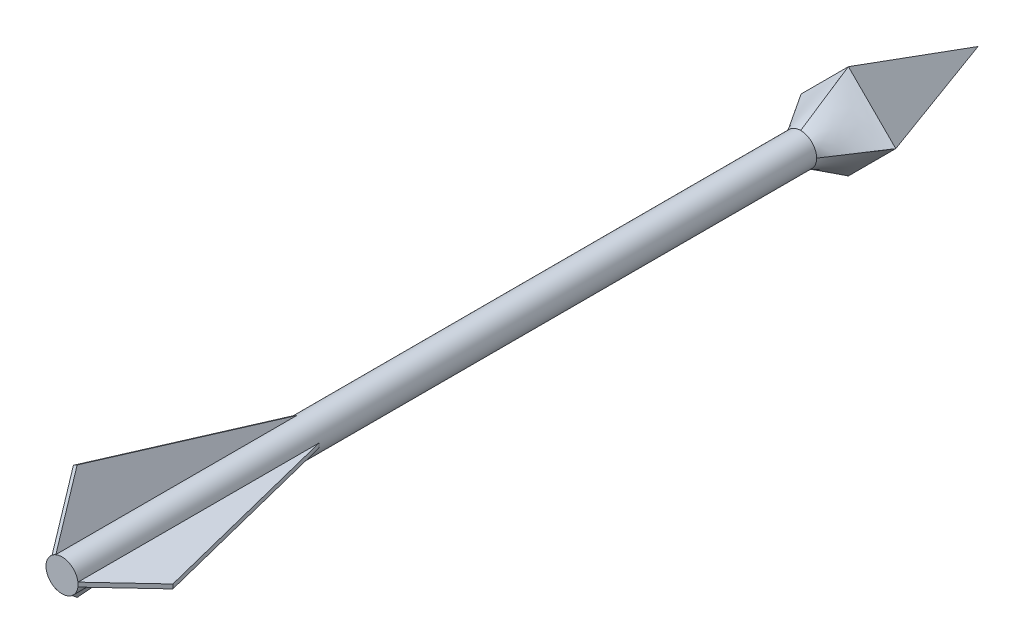
ISO-10303-21;
HEADER;
FILE_DESCRIPTION(('STEP AP214'),'2;1');
FILE_NAME('part.step','',(''),(''),'','','');
FILE_SCHEMA(('AUTOMOTIVE_DESIGN { 1 0 10303 214 1 1 1 1 }'));
ENDSEC;
DATA;
#1=APPLICATION_CONTEXT('core data for automotive mechanical design processes');
#2=APPLICATION_PROTOCOL_DEFINITION('international standard','automotive_design',2000,#1);
#3=PRODUCT_CONTEXT('',#1,'mechanical');
#4=PRODUCT('Part','Part','',(#3));
#5=PRODUCT_RELATED_PRODUCT_CATEGORY('part','',(#4));
#6=PRODUCT_DEFINITION_FORMATION('','',#4);
#7=PRODUCT_DEFINITION_CONTEXT('part definition',#1,'design');
#8=PRODUCT_DEFINITION('design','',#6,#7);
#9=PRODUCT_DEFINITION_SHAPE('','',#8);
#10=(LENGTH_UNIT() NAMED_UNIT(*) SI_UNIT(.MILLI.,.METRE.));
#11=(NAMED_UNIT(*) PLANE_ANGLE_UNIT() SI_UNIT($,.RADIAN.));
#12=(NAMED_UNIT(*) SI_UNIT($,.STERADIAN.) SOLID_ANGLE_UNIT());
#13=UNCERTAINTY_MEASURE_WITH_UNIT(LENGTH_MEASURE(1.E-05),#10,'distance_accuracy_value','');
#14=(GEOMETRIC_REPRESENTATION_CONTEXT(3) GLOBAL_UNCERTAINTY_ASSIGNED_CONTEXT((#13)) GLOBAL_UNIT_ASSIGNED_CONTEXT((#10,
#11,#12)) REPRESENTATION_CONTEXT('',''));
#15=CARTESIAN_POINT('',(0.,0.,0.));
#16=DIRECTION('',(0.,0.,1.));
#17=DIRECTION('',(1.,0.,0.));
#18=AXIS2_PLACEMENT_3D('',#15,#16,#17);
#19=CARTESIAN_POINT('',(-11.3747679879071,19.2016760793635,23.8961325797691));
#20=DIRECTION('',(0.341269166287983,-0.591095535067471,-0.73084979617183));
#21=DIRECTION('',(0.365424898085909,-0.632934489835487,0.682538332575977));
#22=AXIS2_PLACEMENT_3D('',#19,#20,#21);
#23=PLANE('',#22);
#24=DIRECTION('',(-0.365424898085909,0.632934489835487,-0.682538332575977));
#25=VECTOR('',#24,1.);
#26=CARTESIAN_POINT('',(-10.9417552860149,19.4516760793635,23.8961325797691));
#27=LINE('',#26,#25);
#28=CARTESIAN_POINT('',(-0.715632082149516,1.7395111258093,42.9964213582362));
#29=VERTEX_POINT('',#28);
#30=CARTESIAN_POINT('',(-3.57024866431473,6.68385208224818,37.6645864111912));
#31=VERTEX_POINT('',#30);
#32=EDGE_CURVE('E123',#29,#31,#27,.T.);
#33=ORIENTED_EDGE('',*,*,#32,.T.);
#34=DIRECTION('',(0.866025403784443,0.499999999999992,0.));
#35=VECTOR('',#34,1.);
#36=CARTESIAN_POINT('',(-4.00326136620696,6.43385208224819,37.6645864111912));
#37=LINE('',#36,#35);
#38=CARTESIAN_POINT('',(-4.00326136620696,6.43385208224819,37.6645864111912));
#39=VERTEX_POINT('',#38);
#40=EDGE_CURVE('E13',#39,#31,#37,.T.);
#41=ORIENTED_EDGE('',*,*,#40,.F.);
#42=DIRECTION('',(-0.365424898085909,0.632934489835487,-0.682538332575977));
#43=VECTOR('',#42,1.);
#44=CARTESIAN_POINT('',(-11.3747679879071,19.2016760793635,23.8961325797691));
#45=LINE('',#44,#43);
#46=CARTESIAN_POINT('',(-1.14864478404174,1.4895111258093,42.9964213582362));
#47=VERTEX_POINT('',#46);
#48=EDGE_CURVE('E118',#47,#39,#45,.T.);
#49=ORIENTED_EDGE('',*,*,#48,.F.);
#50=DIRECTION('',(0.866025403784443,0.499999999999992,0.));
#51=VECTOR('',#50,1.);
#52=CARTESIAN_POINT('',(-1.14864478404174,1.4895111258093,42.9964213582362));
#53=LINE('',#52,#51);
#54=EDGE_CURVE('E93',#47,#29,#53,.T.);
#55=ORIENTED_EDGE('',*,*,#54,.T.);
#56=EDGE_LOOP('',(#33,#41,#49,#55));
#57=FACE_BOUND('',#56,.T.);
#58=ADVANCED_FACE('F77',(#57),#23,.F.);
#59=CARTESIAN_POINT('',(0.671690679983306,-1.66340238470161,0.446261734044505));
#60=DIRECTION('',(0.484931983438938,-0.839926833531409,0.243647051596933));
#61=DIRECTION('',(-0.121823525798464,0.211004536240123,0.969863966877892));
#62=AXIS2_PLACEMENT_3D('',#59,#60,#61);
#63=PLANE('',#62);
#64=DIRECTION('',(0.121823525798464,-0.211004536240123,-0.969863966877892));
#65=VECTOR('',#64,1.);
#66=CARTESIAN_POINT('',(1.10470338187553,-1.41340238470161,0.446261734044505));
#67=LINE('',#66,#65);
#68=CARTESIAN_POINT('',(-0.715632082149516,1.7395111258093,14.9383539848345));
#69=VERTEX_POINT('',#68);
#70=EDGE_CURVE('E126',#31,#69,#67,.T.);
#71=ORIENTED_EDGE('',*,*,#70,.T.);
#72=DIRECTION('',(0.866025403784443,0.499999999999992,0.));
#73=VECTOR('',#72,1.);
#74=CARTESIAN_POINT('',(-1.14864478404174,1.4895111258093,14.9383539848345));
#75=LINE('',#74,#73);
#76=CARTESIAN_POINT('',(-1.14864478404174,1.4895111258093,14.9383539848345));
#77=VERTEX_POINT('',#76);
#78=EDGE_CURVE('E85',#77,#69,#75,.T.);
#79=ORIENTED_EDGE('',*,*,#78,.F.);
#80=DIRECTION('',(0.121823525798464,-0.211004536240123,-0.969863966877892));
#81=VECTOR('',#80,1.);
#82=CARTESIAN_POINT('',(0.671690679983306,-1.66340238470161,0.446261734044505));
#83=LINE('',#82,#81);
#84=EDGE_CURVE('E111',#39,#77,#83,.T.);
#85=ORIENTED_EDGE('',*,*,#84,.F.);
#86=ORIENTED_EDGE('',*,*,#40,.T.);
#87=EDGE_LOOP('',(#71,#79,#85,#86));
#88=FACE_BOUND('',#87,.T.);
#89=ADVANCED_FACE('F113',(#88),#63,.F.);
#90=CARTESIAN_POINT('',(-1.14864478404174,1.4895111258093,0.));
#91=DIRECTION('',(0.499999999999992,-0.866025403784443,0.));
#92=DIRECTION('',(0.,0.,1.));
#93=AXIS2_PLACEMENT_3D('',#90,#91,#92);
#94=PLANE('',#93);
#95=DIRECTION('',(0.,0.,-1.));
#96=VECTOR('',#95,1.);
#97=CARTESIAN_POINT('',(-0.715632082149516,1.7395111258093,0.));
#98=LINE('',#97,#96);
#99=EDGE_CURVE('E121',#29,#69,#98,.T.);
#100=ORIENTED_EDGE('',*,*,#99,.F.);
#101=ORIENTED_EDGE('',*,*,#54,.F.);
#102=DIRECTION('',(0.,0.,-1.));
#103=VECTOR('',#102,1.);
#104=CARTESIAN_POINT('',(-1.14864478404174,1.4895111258093,0.));
#105=LINE('',#104,#103);
#106=EDGE_CURVE('E117',#47,#77,#105,.T.);
#107=ORIENTED_EDGE('',*,*,#106,.T.);
#108=ORIENTED_EDGE('',*,*,#78,.T.);
#109=EDGE_LOOP('',(#100,#101,#107,#108));
#110=FACE_BOUND('',#109,.T.);
#111=ADVANCED_FACE('F132',(#110),#94,.T.);
#112=CARTESIAN_POINT('',(-0.216506350946111,-0.124999999999998,0.));
#113=DIRECTION('',(-0.866025403784443,-0.499999999999992,0.));
#114=DIRECTION('',(0.,0.,1.));
#115=AXIS2_PLACEMENT_3D('',#112,#113,#114);
#116=PLANE('',#115);
#117=ORIENTED_EDGE('',*,*,#48,.T.);
#118=ORIENTED_EDGE('',*,*,#84,.T.);
#119=ORIENTED_EDGE('',*,*,#106,.F.);
#120=EDGE_LOOP('',(#117,#118,#119));
#121=FACE_BOUND('',#120,.T.);
#122=ADVANCED_FACE('F120',(#121),#116,.T.);
#123=CARTESIAN_POINT('',(0.216506350946111,0.124999999999998,0.));
#124=DIRECTION('',(-0.866025403784443,-0.499999999999992,0.));
#125=DIRECTION('',(0.,0.,1.));
#126=AXIS2_PLACEMENT_3D('',#123,#124,#125);
#127=PLANE('',#126);
#128=ORIENTED_EDGE('',*,*,#32,.F.);
#129=ORIENTED_EDGE('',*,*,#99,.T.);
#130=ORIENTED_EDGE('',*,*,#70,.F.);
#131=EDGE_LOOP('',(#128,#129,#130));
#132=FACE_BOUND('',#131,.T.);
#133=ADVANCED_FACE('F139',(#132),#127,.F.);
#134=CLOSED_SHELL('',(#58,#89,#111,#122,#133));
#135=MANIFOLD_SOLID_BREP('B2',#134);
#136=CARTESIAN_POINT('',(-10.9417552860152,-19.4516760793634,23.8961325797691));
#137=DIRECTION('',(0.341269166287991,0.591095535067466,-0.73084979617183));
#138=DIRECTION('',(0.365424898085918,0.632934489835482,0.682538332575977));
#139=AXIS2_PLACEMENT_3D('',#136,#137,#138);
#140=PLANE('',#139);
#141=DIRECTION('',(-0.365424898085918,-0.632934489835482,-0.682538332575977));
#142=VECTOR('',#141,1.);
#143=CARTESIAN_POINT('',(-11.3747679879074,-19.2016760793634,23.8961325797691));
#144=LINE('',#143,#142);
#145=CARTESIAN_POINT('',(-1.14864478404176,-1.48951112580929,42.9964213582362));
#146=VERTEX_POINT('',#145);
#147=CARTESIAN_POINT('',(-4.00326136620705,-6.43385208224813,37.6645864111912));
#148=VERTEX_POINT('',#147);
#149=EDGE_CURVE('E230',#146,#148,#144,.T.);
#150=ORIENTED_EDGE('',*,*,#149,.T.);
#151=DIRECTION('',(-0.866025403784436,0.500000000000004,0.));
#152=VECTOR('',#151,1.);
#153=CARTESIAN_POINT('',(-3.57024866431483,-6.68385208224813,37.6645864111912));
#154=LINE('',#153,#152);
#155=CARTESIAN_POINT('',(-3.57024866431483,-6.68385208224813,37.6645864111912));
#156=VERTEX_POINT('',#155);
#157=EDGE_CURVE('E75',#156,#148,#154,.T.);
#158=ORIENTED_EDGE('',*,*,#157,.F.);
#159=DIRECTION('',(-0.365424898085918,-0.632934489835482,-0.682538332575977));
#160=VECTOR('',#159,1.);
#161=CARTESIAN_POINT('',(-10.9417552860152,-19.4516760793634,23.8961325797691));
#162=LINE('',#161,#160);
#163=CARTESIAN_POINT('',(-0.71563208214954,-1.73951112580929,42.9964213582362));
#164=VERTEX_POINT('',#163);
#165=EDGE_CURVE('E225',#164,#156,#162,.T.);
#166=ORIENTED_EDGE('',*,*,#165,.F.);
#167=DIRECTION('',(-0.866025403784436,0.500000000000004,0.));
#168=VECTOR('',#167,1.);
#169=CARTESIAN_POINT('',(-0.71563208214954,-1.73951112580929,42.9964213582362));
#170=LINE('',#169,#168);
#171=EDGE_CURVE('E200',#164,#146,#170,.T.);
#172=ORIENTED_EDGE('',*,*,#171,.T.);
#173=EDGE_LOOP('',(#150,#158,#166,#172));
#174=FACE_BOUND('',#173,.T.);
#175=ADVANCED_FACE('F184',(#174),#140,.F.);
#176=CARTESIAN_POINT('',(1.10470338187555,1.4134023847016,0.446261734044505));
#177=DIRECTION('',(0.48493198343895,0.839926833531402,0.243647051596933));
#178=DIRECTION('',(-0.121823525798467,-0.211004536240121,0.969863966877892));
#179=AXIS2_PLACEMENT_3D('',#176,#177,#178);
#180=PLANE('',#179);
#181=DIRECTION('',(0.121823525798467,0.211004536240121,-0.969863966877892));
#182=VECTOR('',#181,1.);
#183=CARTESIAN_POINT('',(0.67169067998333,1.6634023847016,0.446261734044505));
#184=LINE('',#183,#182);
#185=CARTESIAN_POINT('',(-1.14864478404176,-1.48951112580929,14.9383539848345));
#186=VERTEX_POINT('',#185);
#187=EDGE_CURVE('E233',#148,#186,#184,.T.);
#188=ORIENTED_EDGE('',*,*,#187,.T.);
#189=DIRECTION('',(-0.866025403784436,0.500000000000004,0.));
#190=VECTOR('',#189,1.);
#191=CARTESIAN_POINT('',(-0.71563208214954,-1.73951112580929,14.9383539848345));
#192=LINE('',#191,#190);
#193=CARTESIAN_POINT('',(-0.71563208214954,-1.73951112580929,14.9383539848345));
#194=VERTEX_POINT('',#193);
#195=EDGE_CURVE('E192',#194,#186,#192,.T.);
#196=ORIENTED_EDGE('',*,*,#195,.F.);
#197=DIRECTION('',(0.121823525798467,0.211004536240121,-0.969863966877892));
#198=VECTOR('',#197,1.);
#199=CARTESIAN_POINT('',(1.10470338187555,1.4134023847016,0.446261734044505));
#200=LINE('',#199,#198);
#201=EDGE_CURVE('E218',#156,#194,#200,.T.);
#202=ORIENTED_EDGE('',*,*,#201,.F.);
#203=ORIENTED_EDGE('',*,*,#157,.T.);
#204=EDGE_LOOP('',(#188,#196,#202,#203));
#205=FACE_BOUND('',#204,.T.);
#206=ADVANCED_FACE('F220',(#205),#180,.F.);
#207=CARTESIAN_POINT('',(-0.71563208214954,-1.73951112580929,0.));
#208=DIRECTION('',(0.500000000000004,0.866025403784436,0.));
#209=DIRECTION('',(0.,0.,1.));
#210=AXIS2_PLACEMENT_3D('',#207,#208,#209);
#211=PLANE('',#210);
#212=DIRECTION('',(0.,0.,-1.));
#213=VECTOR('',#212,1.);
#214=CARTESIAN_POINT('',(-1.14864478404176,-1.48951112580929,0.));
#215=LINE('',#214,#213);
#216=EDGE_CURVE('E228',#146,#186,#215,.T.);
#217=ORIENTED_EDGE('',*,*,#216,.F.);
#218=ORIENTED_EDGE('',*,*,#171,.F.);
#219=DIRECTION('',(0.,0.,-1.));
#220=VECTOR('',#219,1.);
#221=CARTESIAN_POINT('',(-0.71563208214954,-1.73951112580929,0.));
#222=LINE('',#221,#220);
#223=EDGE_CURVE('E224',#164,#194,#222,.T.);
#224=ORIENTED_EDGE('',*,*,#223,.T.);
#225=ORIENTED_EDGE('',*,*,#195,.T.);
#226=EDGE_LOOP('',(#217,#218,#224,#225));
#227=FACE_BOUND('',#226,.T.);
#228=ADVANCED_FACE('F239',(#227),#211,.T.);
#229=CARTESIAN_POINT('',(0.216506350946109,-0.125000000000001,0.));
#230=DIRECTION('',(0.866025403784436,-0.500000000000004,0.));
#231=DIRECTION('',(0.,0.,1.));
#232=AXIS2_PLACEMENT_3D('',#229,#230,#231);
#233=PLANE('',#232);
#234=ORIENTED_EDGE('',*,*,#165,.T.);
#235=ORIENTED_EDGE('',*,*,#201,.T.);
#236=ORIENTED_EDGE('',*,*,#223,.F.);
#237=EDGE_LOOP('',(#234,#235,#236));
#238=FACE_BOUND('',#237,.T.);
#239=ADVANCED_FACE('F227',(#238),#233,.T.);
#240=CARTESIAN_POINT('',(-0.216506350946109,0.125000000000001,0.));
#241=DIRECTION('',(0.866025403784436,-0.500000000000004,0.));
#242=DIRECTION('',(0.,0.,1.));
#243=AXIS2_PLACEMENT_3D('',#240,#241,#242);
#244=PLANE('',#243);
#245=ORIENTED_EDGE('',*,*,#149,.F.);
#246=ORIENTED_EDGE('',*,*,#216,.T.);
#247=ORIENTED_EDGE('',*,*,#187,.F.);
#248=EDGE_LOOP('',(#245,#246,#247));
#249=FACE_BOUND('',#248,.T.);
#250=ADVANCED_FACE('F246',(#249),#244,.F.);
#251=CLOSED_SHELL('',(#175,#206,#228,#239,#250));
#252=MANIFOLD_SOLID_BREP('B7',#251);
#253=CARTESIAN_POINT('',(22.3165232739224,0.25,23.8961325797691));
#254=DIRECTION('',(-0.682538332575977,0.,-0.73084979617183));
#255=DIRECTION('',(-0.73084979617183,0.,0.682538332575977));
#256=AXIS2_PLACEMENT_3D('',#253,#254,#255);
#257=PLANE('',#256);
#258=DIRECTION('',(0.73084979617183,0.,-0.682538332575977));
#259=VECTOR('',#258,1.);
#260=CARTESIAN_POINT('',(22.3165232739224,-0.25,23.8961325797691));
#261=LINE('',#260,#259);
#262=CARTESIAN_POINT('',(1.86427686619128,-0.25,42.9964213582362));
#263=VERTEX_POINT('',#262);
#264=CARTESIAN_POINT('',(7.57351003052181,-0.25,37.6645864111912));
#265=VERTEX_POINT('',#264);
#266=EDGE_CURVE('E336',#263,#265,#261,.T.);
#267=ORIENTED_EDGE('',*,*,#266,.T.);
#268=DIRECTION('',(0.,-1.,0.));
#269=VECTOR('',#268,1.);
#270=CARTESIAN_POINT('',(7.57351003052181,0.25,37.6645864111912));
#271=LINE('',#270,#269);
#272=CARTESIAN_POINT('',(7.57351003052181,0.25,37.6645864111912));
#273=VERTEX_POINT('',#272);
#274=EDGE_CURVE('E182',#273,#265,#271,.T.);
#275=ORIENTED_EDGE('',*,*,#274,.F.);
#276=DIRECTION('',(0.73084979617183,0.,-0.682538332575977));
#277=VECTOR('',#276,1.);
#278=CARTESIAN_POINT('',(22.3165232739224,0.25,23.8961325797691));
#279=LINE('',#278,#277);
#280=CARTESIAN_POINT('',(1.86427686619128,0.25,42.9964213582362));
#281=VERTEX_POINT('',#280);
#282=EDGE_CURVE('E331',#281,#273,#279,.T.);
#283=ORIENTED_EDGE('',*,*,#282,.F.);
#284=DIRECTION('',(0.,-1.,0.));
#285=VECTOR('',#284,1.);
#286=CARTESIAN_POINT('',(1.86427686619128,0.25,42.9964213582362));
#287=LINE('',#286,#285);
#288=EDGE_CURVE('E306',#281,#263,#287,.T.);
#289=ORIENTED_EDGE('',*,*,#288,.T.);
#290=EDGE_LOOP('',(#267,#275,#283,#289));
#291=FACE_BOUND('',#290,.T.);
#292=ADVANCED_FACE('F290',(#291),#257,.F.);
#293=CARTESIAN_POINT('',(-1.77639406185886,0.25,0.446261734044505));
#294=DIRECTION('',(-0.969863966877892,0.,0.243647051596933));
#295=DIRECTION('',(0.243647051596933,0.,0.969863966877892));
#296=AXIS2_PLACEMENT_3D('',#293,#294,#295);
#297=PLANE('',#296);
#298=DIRECTION('',(-0.243647051596933,0.,-0.969863966877892));
#299=VECTOR('',#298,1.);
#300=CARTESIAN_POINT('',(-1.77639406185886,-0.25,0.446261734044505));
#301=LINE('',#300,#299);
#302=CARTESIAN_POINT('',(1.86427686619128,-0.25,14.9383539848345));
#303=VERTEX_POINT('',#302);
#304=EDGE_CURVE('E339',#265,#303,#301,.T.);
#305=ORIENTED_EDGE('',*,*,#304,.T.);
#306=DIRECTION('',(0.,-1.,0.));
#307=VECTOR('',#306,1.);
#308=CARTESIAN_POINT('',(1.86427686619128,0.25,14.9383539848345));
#309=LINE('',#308,#307);
#310=CARTESIAN_POINT('',(1.86427686619128,0.25,14.9383539848345));
#311=VERTEX_POINT('',#310);
#312=EDGE_CURVE('E298',#311,#303,#309,.T.);
#313=ORIENTED_EDGE('',*,*,#312,.F.);
#314=DIRECTION('',(-0.243647051596933,0.,-0.969863966877892));
#315=VECTOR('',#314,1.);
#316=CARTESIAN_POINT('',(-1.77639406185886,0.25,0.446261734044505));
#317=LINE('',#316,#315);
#318=EDGE_CURVE('E324',#273,#311,#317,.T.);
#319=ORIENTED_EDGE('',*,*,#318,.F.);
#320=ORIENTED_EDGE('',*,*,#274,.T.);
#321=EDGE_LOOP('',(#305,#313,#319,#320));
#322=FACE_BOUND('',#321,.T.);
#323=ADVANCED_FACE('F326',(#322),#297,.F.);
#324=CARTESIAN_POINT('',(1.86427686619128,0.25,0.));
#325=DIRECTION('',(-1.,0.,0.));
#326=DIRECTION('',(0.,0.,1.));
#327=AXIS2_PLACEMENT_3D('',#324,#325,#326);
#328=PLANE('',#327);
#329=DIRECTION('',(0.,0.,-1.));
#330=VECTOR('',#329,1.);
#331=CARTESIAN_POINT('',(1.86427686619128,-0.25,0.));
#332=LINE('',#331,#330);
#333=EDGE_CURVE('E334',#263,#303,#332,.T.);
#334=ORIENTED_EDGE('',*,*,#333,.F.);
#335=ORIENTED_EDGE('',*,*,#288,.F.);
#336=DIRECTION('',(0.,0.,-1.));
#337=VECTOR('',#336,1.);
#338=CARTESIAN_POINT('',(1.86427686619128,0.25,0.));
#339=LINE('',#338,#337);
#340=EDGE_CURVE('E330',#281,#311,#339,.T.);
#341=ORIENTED_EDGE('',*,*,#340,.T.);
#342=ORIENTED_EDGE('',*,*,#312,.T.);
#343=EDGE_LOOP('',(#334,#335,#341,#342));
#344=FACE_BOUND('',#343,.T.);
#345=ADVANCED_FACE('F345',(#344),#328,.T.);
#346=CARTESIAN_POINT('',(0.,0.25,0.));
#347=DIRECTION('',(0.,1.,0.));
#348=DIRECTION('',(0.,0.,1.));
#349=AXIS2_PLACEMENT_3D('',#346,#347,#348);
#350=PLANE('',#349);
#351=ORIENTED_EDGE('',*,*,#282,.T.);
#352=ORIENTED_EDGE('',*,*,#318,.T.);
#353=ORIENTED_EDGE('',*,*,#340,.F.);
#354=EDGE_LOOP('',(#351,#352,#353));
#355=FACE_BOUND('',#354,.T.);
#356=ADVANCED_FACE('F333',(#355),#350,.T.);
#357=CARTESIAN_POINT('',(0.,-0.25,0.));
#358=DIRECTION('',(0.,1.,0.));
#359=DIRECTION('',(0.,0.,1.));
#360=AXIS2_PLACEMENT_3D('',#357,#358,#359);
#361=PLANE('',#360);
#362=ORIENTED_EDGE('',*,*,#266,.F.);
#363=ORIENTED_EDGE('',*,*,#333,.T.);
#364=ORIENTED_EDGE('',*,*,#304,.F.);
#365=EDGE_LOOP('',(#362,#363,#364));
#366=FACE_BOUND('',#365,.T.);
#367=ADVANCED_FACE('F352',(#366),#361,.F.);
#368=CLOSED_SHELL('',(#292,#323,#345,#356,#367));
#369=MANIFOLD_SOLID_BREP('B69',#368);
#370=CARTESIAN_POINT('',(0.,0.,42.9964213582362));
#371=DIRECTION('',(0.,0.,-1.));
#372=DIRECTION('',(-1.,0.,0.));
#373=AXIS2_PLACEMENT_3D('',#370,#371,#372);
#374=PLANE('',#373);
#375=CARTESIAN_POINT('',(0.,0.,42.9964213582362));
#376=DIRECTION('',(0.,0.,-1.));
#377=DIRECTION('',(-1.,0.,0.));
#378=AXIS2_PLACEMENT_3D('',#375,#376,#377);
#379=CIRCLE('',#378,1.86427686619128);
#380=CARTESIAN_POINT('',(-1.86427686619128,0.,42.9964213582362));
#381=VERTEX_POINT('',#380);
#382=EDGE_CURVE('E288',#381,#381,#379,.T.);
#383=ORIENTED_EDGE('',*,*,#382,.F.);
#384=EDGE_LOOP('',(#383));
#385=FACE_BOUND('',#384,.T.);
#386=ADVANCED_FACE('F388',(#385),#374,.F.);
#387=CARTESIAN_POINT('',(0.,0.,-63.6469159290233));
#388=DIRECTION('',(0.,0.,-1.));
#389=DIRECTION('',(-1.,0.,0.));
#390=AXIS2_PLACEMENT_3D('',#387,#388,#389);
#391=CYLINDRICAL_SURFACE('',#390,1.86427686619128);
#392=CARTESIAN_POINT('',(-1.86427686619128,0.,-42.9964213582362));
#393=CARTESIAN_POINT('',(-1.86428270601178,0.0524318803976472,-42.9964433896541));
#394=CARTESIAN_POINT('',(-1.86206523022339,0.104863699002284,-42.9965263707443));
#395=CARTESIAN_POINT('',(-1.85322498472643,0.209352078093115,-42.9966938199869));
#396=CARTESIAN_POINT('',(-1.84660243935823,0.261408657552936,-42.9967782880634));
#397=CARTESIAN_POINT('',(-1.82900001198042,0.364737933597131,-42.996828306932));
#398=CARTESIAN_POINT('',(-1.81802341378971,0.416011190765503,-42.9967939471935));
#399=CARTESIAN_POINT('',(-1.79178966783767,0.517456779233548,-42.9966545787557));
#400=CARTESIAN_POINT('',(-1.77653258122061,0.56762912624804,-42.9965495710656));
#401=CARTESIAN_POINT('',(-1.75052014123938,0.641790479091365,-42.9964387491247));
#402=CARTESIAN_POINT('',(-1.74132437432959,0.666336583763045,-42.9964095880247));
#403=CARTESIAN_POINT('',(-1.72190656774221,0.715019408420174,-42.9964342952568));
#404=CARTESIAN_POINT('',(-1.71168452904697,0.739156128797464,-42.9964881635094));
#405=CARTESIAN_POINT('',(-1.67950538611825,0.81088553022716,-42.9967237387634));
#406=CARTESIAN_POINT('',(-1.65603158011933,0.85780792464424,-42.9969794077647));
#407=CARTESIAN_POINT('',(-1.60522120119517,0.949494825714478,-42.9973421260281));
#408=CARTESIAN_POINT('',(-1.57788532267364,0.994259718351892,-42.9974492019701));
#409=CARTESIAN_POINT('',(-1.51954081860156,1.08132796580144,-42.9974101321394));
#410=CARTESIAN_POINT('',(-1.48853220847946,1.12363133095286,-42.9972639874306));
#411=CARTESIAN_POINT('',(-1.42306409007354,1.20547148556822,-42.9968540547957));
#412=CARTESIAN_POINT('',(-1.3886052743717,1.24500882757772,-42.9965902904438));
#413=CARTESIAN_POINT('',(-1.33452102689567,1.30202489655381,-42.9964254861057));
#414=CARTESIAN_POINT('',(-1.31609140493958,1.3206505566927,-42.9964090361343));
#415=CARTESIAN_POINT('',(-1.27846395067144,1.35710885033665,-42.9964782273987));
#416=CARTESIAN_POINT('',(-1.25926611643255,1.37494148185241,-42.9965638688906));
#417=CARTESIAN_POINT('',(-1.20056403623964,1.42720657873475,-42.9968599982645));
#418=CARTESIAN_POINT('',(-1.15995036340317,1.46040714168543,-42.9971096932254));
#419=CARTESIAN_POINT('',(-1.07607623930595,1.52326475167148,-42.9974144447953));
#420=CARTESIAN_POINT('',(-1.03281583841916,1.55292186611597,-42.9974695051076));
#421=CARTESIAN_POINT('',(-0.943940737369396,1.60849338267224,-42.9973355853831));
#422=CARTESIAN_POINT('',(-0.89832556782759,1.6344070346546,-42.9971465565101));
#423=CARTESIAN_POINT('',(-0.805072245597529,1.68230049308141,-42.9967288889016));
#424=CARTESIAN_POINT('',(-0.757433964313325,1.70428004899671,-42.9965002476454));
#425=CARTESIAN_POINT('',(-0.660496668543537,1.74413779939021,-42.9963716749132));
#426=CARTESIAN_POINT('',(-0.611198494101473,1.76201803372271,-42.9964715795689));
#427=CARTESIAN_POINT('',(-0.511291007451994,1.79355931088054,-42.9966611162171));
#428=CARTESIAN_POINT('',(-0.460682008805347,1.8072213528143,-42.9967507506389));
#429=CARTESIAN_POINT('',(-0.342388017622672,1.83385821447901,-42.9968357718419));
#430=CARTESIAN_POINT('',(-0.274339596422201,1.84526481801524,-42.9967926394995));
#431=CARTESIAN_POINT('',(-0.171719384799283,1.85667074035494,-42.9966391632023));
#432=CARTESIAN_POINT('',(-0.137438541838059,1.85952204817448,-42.9965732628588));
#433=CARTESIAN_POINT('',(-0.0687746361683523,1.86332485448751,-42.996465697083));
#434=CARTESIAN_POINT('',(-0.0343915827591553,1.86427652081717,-42.9964240295098));
#435=CARTESIAN_POINT('',(0.,1.86427686619128,-42.9964213582362));
#436=B_SPLINE_CURVE_WITH_KNOTS('',3,(#392,#393,#394,#395,#396,#397,#398,#399,#400,#401,#402,
#403,#404,#405,#406,#407,#408,#409,#410,#411,#412,#413,#414,#415,#416,#417,#418,#419,#420,#421,
#422,#423,#424,#425,#426,#427,#428,#429,#430,#431,#432,#433,#434,#435),.UNSPECIFIED.,.F.,.F.,(4,
2,2,2,2,2,2,2,2,2,2,2,2,2,2,2,2,2,2,2,2,4),(0.,0.157249241578817,0.314490475417621,
0.471613342994179,0.628733966276864,0.70735009004232,0.785966138556107,0.943165045697661,
1.1003357242364,1.25750574255477,1.41464427413627,1.49323117570741,1.5718182744033,
1.72898878144459,1.88615629806194,2.04335526495465,2.20056423895451,2.3576948139295,
2.51478814282513,2.72130033602189,2.82445404310626,2.92759863600289),.UNSPECIFIED.);
#437=CARTESIAN_POINT('',(-1.86427686619128,0.,-42.9964213582362));
#438=VERTEX_POINT('',#437);
#439=CARTESIAN_POINT('',(0.,1.86427686619128,-42.9964213582362));
#440=VERTEX_POINT('',#439);
#441=EDGE_CURVE('E398',#438,#440,#436,.T.);
#442=ORIENTED_EDGE('',*,*,#441,.F.);
#443=CARTESIAN_POINT('',(0.,-1.86427686619128,-42.9964213582362));
#444=CARTESIAN_POINT('',(-0.052431880397618,-1.86428270601178,-42.9964433896541));
#445=CARTESIAN_POINT('',(-0.104863699002255,-1.86206523022339,-42.9965263707443));
#446=CARTESIAN_POINT('',(-0.209352078093086,-1.85322498472643,-42.9966938199869));
#447=CARTESIAN_POINT('',(-0.261408657552907,-1.84660243935824,-42.9967782880634));
#448=CARTESIAN_POINT('',(-0.364737933597102,-1.82900001198043,-42.996828306932));
#449=CARTESIAN_POINT('',(-0.416011190765474,-1.81802341378971,-42.9967939471935));
#450=CARTESIAN_POINT('',(-0.517456779233519,-1.79178966783768,-42.9966545787557));
#451=CARTESIAN_POINT('',(-0.567629126248012,-1.77653258122062,-42.9965495710656));
#452=CARTESIAN_POINT('',(-0.641790479091337,-1.75052014123939,-42.9964387491247));
#453=CARTESIAN_POINT('',(-0.666336583763017,-1.7413243743296,-42.9964095880246));
#454=CARTESIAN_POINT('',(-0.715019408420146,-1.72190656774222,-42.9964342952568));
#455=CARTESIAN_POINT('',(-0.739156128797436,-1.71168452904698,-42.9964881635094));
#456=CARTESIAN_POINT('',(-0.810885530227134,-1.67950538611826,-42.9967237387634));
#457=CARTESIAN_POINT('',(-0.857807924644213,-1.65603158011935,-42.9969794077647));
#458=CARTESIAN_POINT('',(-0.949494825714452,-1.60522120119519,-42.9973421260281));
#459=CARTESIAN_POINT('',(-0.994259718351867,-1.57788532267365,-42.9974492019701));
#460=CARTESIAN_POINT('',(-1.08132796580142,-1.51954081860158,-42.9974101321394));
#461=CARTESIAN_POINT('',(-1.12363133095284,-1.48853220847948,-42.9972639874305));
#462=CARTESIAN_POINT('',(-1.2054714855682,-1.42306409007356,-42.9968540547957));
#463=CARTESIAN_POINT('',(-1.2450088275777,-1.38860527437172,-42.9965902904437));
#464=CARTESIAN_POINT('',(-1.30202489655379,-1.33452102689569,-42.9964254861057));
#465=CARTESIAN_POINT('',(-1.32065055669267,-1.31609140493961,-42.9964090361343));
#466=CARTESIAN_POINT('',(-1.35710885033663,-1.27846395067146,-42.9964782273987));
#467=CARTESIAN_POINT('',(-1.37494148185239,-1.25926611643257,-42.9965638688906));
#468=CARTESIAN_POINT('',(-1.42720657873473,-1.20056403623966,-42.9968599982645));
#469=CARTESIAN_POINT('',(-1.46040714168541,-1.15995036340319,-42.9971096932254));
#470=CARTESIAN_POINT('',(-1.52326475167146,-1.07607623930598,-42.9974144447953));
#471=CARTESIAN_POINT('',(-1.55292186611595,-1.03281583841919,-42.9974695051076));
#472=CARTESIAN_POINT('',(-1.60849338267222,-0.943940737369421,-42.9973355853831));
#473=CARTESIAN_POINT('',(-1.63440703465459,-0.898325567827615,-42.9971465565101));
#474=CARTESIAN_POINT('',(-1.68230049308139,-0.805072245597554,-42.9967288889016));
#475=CARTESIAN_POINT('',(-1.7042800489967,-0.757433964313351,-42.9965002476453));
#476=CARTESIAN_POINT('',(-1.7441377993902,-0.660496668543563,-42.9963716749132));
#477=CARTESIAN_POINT('',(-1.7620180337227,-0.6111984941015,-42.996471579569));
#478=CARTESIAN_POINT('',(-1.79355931088054,-0.511291007452021,-42.9966611162171));
#479=CARTESIAN_POINT('',(-1.80722135281429,-0.460682008805374,-42.9967507506389));
#480=CARTESIAN_POINT('',(-1.83385821447901,-0.342388017622695,-42.9968357718419));
#481=CARTESIAN_POINT('',(-1.84526481801524,-0.274339596422219,-42.9967926394995));
#482=CARTESIAN_POINT('',(-1.85667074035494,-0.171719384799294,-42.9966391632023));
#483=CARTESIAN_POINT('',(-1.85952204817448,-0.137438541838069,-42.9965732628588));
#484=CARTESIAN_POINT('',(-1.86332485448751,-0.0687746361683569,-42.996465697083));
#485=CARTESIAN_POINT('',(-1.86427652081717,-0.0343915827591576,-42.9964240295098));
#486=CARTESIAN_POINT('',(-1.86427686619128,0.,-42.9964213582362));
#487=B_SPLINE_CURVE_WITH_KNOTS('',3,(#443,#444,#445,#446,#447,#448,#449,#450,#451,#452,#453,
#454,#455,#456,#457,#458,#459,#460,#461,#462,#463,#464,#465,#466,#467,#468,#469,#470,#471,#472,
#473,#474,#475,#476,#477,#478,#479,#480,#481,#482,#483,#484,#485,#486),.UNSPECIFIED.,.F.,.F.,(4,
2,2,2,2,2,2,2,2,2,2,2,2,2,2,2,2,2,2,2,2,4),(0.,0.157249241578816,0.314490475417621,
0.471613342994178,0.628733966276863,0.707350090042319,0.785966138556107,0.94316504569766,
1.1003357242364,1.25750574255477,1.41464427413626,1.49323117570741,1.5718182744033,
1.72898878144459,1.88615629806194,2.04335526495465,2.20056423895451,2.3576948139295,
2.51478814282513,2.7213003360219,2.82445404310629,2.92759863600292),.UNSPECIFIED.);
#488=CARTESIAN_POINT('',(0.,-1.86427686619128,-42.9964213582362));
#489=VERTEX_POINT('',#488);
#490=EDGE_CURVE('E538',#489,#438,#487,.T.);
#491=ORIENTED_EDGE('',*,*,#490,.F.);
#492=CARTESIAN_POINT('',(1.86427686619128,0.,-42.9964213582362));
#493=CARTESIAN_POINT('',(1.86428270601179,-0.05243188039759,-42.9964433896541));
#494=CARTESIAN_POINT('',(1.86206523022339,-0.104863699002227,-42.9965263707443));
#495=CARTESIAN_POINT('',(1.85322498472644,-0.209352078093058,-42.9966938199869));
#496=CARTESIAN_POINT('',(1.84660243935824,-0.261408657552879,-42.9967782880634));
#497=CARTESIAN_POINT('',(1.82900001198043,-0.364737933597075,-42.996828306932));
#498=CARTESIAN_POINT('',(1.81802341378972,-0.416011190765447,-42.9967939471935));
#499=CARTESIAN_POINT('',(1.79178966783768,-0.517456779233493,-42.9966545787557));
#500=CARTESIAN_POINT('',(1.77653258122063,-0.567629126247986,-42.9965495710656));
#501=CARTESIAN_POINT('',(1.7505201412394,-0.641790479091311,-42.9964387491247));
#502=CARTESIAN_POINT('',(1.74132437432961,-0.666336583762992,-42.9964095880246));
#503=CARTESIAN_POINT('',(1.72190656774223,-0.715019408420121,-42.9964342952568));
#504=CARTESIAN_POINT('',(1.71168452904699,-0.739156128797411,-42.9964881635094));
#505=CARTESIAN_POINT('',(1.67950538611827,-0.810885530227109,-42.9967237387634));
#506=CARTESIAN_POINT('',(1.65603158011936,-0.857807924644189,-42.9969794077647));
#507=CARTESIAN_POINT('',(1.6052212011952,-0.949494825714429,-42.9973421260281));
#508=CARTESIAN_POINT('',(1.57788532267367,-0.994259718351844,-42.9974492019701));
#509=CARTESIAN_POINT('',(1.5195408186016,-1.08132796580139,-42.9974101321394));
#510=CARTESIAN_POINT('',(1.48853220847949,-1.12363133095282,-42.9972639874306));
#511=CARTESIAN_POINT('',(1.42306409007358,-1.20547148556818,-42.9968540547957));
#512=CARTESIAN_POINT('',(1.38860527437174,-1.24500882757768,-42.9965902904437));
#513=CARTESIAN_POINT('',(1.33452102689571,-1.30202489655377,-42.9964254861057));
#514=CARTESIAN_POINT('',(1.31609140493962,-1.32065055669266,-42.9964090361343));
#515=CARTESIAN_POINT('',(1.27846395067148,-1.35710885033662,-42.9964782273987));
#516=CARTESIAN_POINT('',(1.25926611643259,-1.37494148185238,-42.9965638688906));
#517=CARTESIAN_POINT('',(1.20056403623969,-1.42720657873471,-42.9968599982645));
#518=CARTESIAN_POINT('',(1.15995036340322,-1.4604071416854,-42.9971096932254));
#519=CARTESIAN_POINT('',(1.076076239306,-1.52326475167145,-42.9974144447953));
#520=CARTESIAN_POINT('',(1.03281583841921,-1.55292186611594,-42.9974695051076));
#521=CARTESIAN_POINT('',(0.943940737369445,-1.60849338267221,-42.9973355853831));
#522=CARTESIAN_POINT('',(0.89832556782764,-1.63440703465457,-42.9971465565101));
#523=CARTESIAN_POINT('',(0.80507224559758,-1.68230049308138,-42.9967288889016));
#524=CARTESIAN_POINT('',(0.757433964313376,-1.70428004899668,-42.9965002476453));
#525=CARTESIAN_POINT('',(0.660496668543589,-1.74413779939019,-42.9963716749132));
#526=CARTESIAN_POINT('',(0.611198494101526,-1.76201803372269,-42.996471579569));
#527=CARTESIAN_POINT('',(0.511291007452048,-1.79355931088053,-42.9966611162171));
#528=CARTESIAN_POINT('',(0.460682008805401,-1.80722135281428,-42.9967507506389));
#529=CARTESIAN_POINT('',(0.342388017622718,-1.833858214479,-42.9968357718419));
#530=CARTESIAN_POINT('',(0.274339596422238,-1.84526481801524,-42.9967926394996));
#531=CARTESIAN_POINT('',(0.171719384799306,-1.85667074035494,-42.9966391632023));
#532=CARTESIAN_POINT('',(0.137438541838078,-1.85952204817448,-42.9965732628588));
#533=CARTESIAN_POINT('',(0.0687746361683618,-1.86332485448751,-42.996465697083));
#534=CARTESIAN_POINT('',(0.0343915827591602,-1.86427652081717,-42.9964240295098));
#535=CARTESIAN_POINT('',(0.,-1.86427686619128,-42.9964213582362));
#536=B_SPLINE_CURVE_WITH_KNOTS('',3,(#492,#493,#494,#495,#496,#497,#498,#499,#500,#501,#502,
#503,#504,#505,#506,#507,#508,#509,#510,#511,#512,#513,#514,#515,#516,#517,#518,#519,#520,#521,
#522,#523,#524,#525,#526,#527,#528,#529,#530,#531,#532,#533,#534,#535),.UNSPECIFIED.,.F.,.F.,(4,
2,2,2,2,2,2,2,2,2,2,2,2,2,2,2,2,2,2,2,2,4),(0.,0.157249241578816,0.314490475417621,
0.471613342994179,0.628733966276864,0.70735009004232,0.785966138556107,0.943165045697661,
1.1003357242364,1.25750574255477,1.41464427413627,1.49323117570741,1.5718182744033,
1.72898878144459,1.88615629806194,2.04335526495465,2.20056423895451,2.3576948139295,
2.51478814282513,2.72130033602192,2.82445404310631,2.92759863600295),.UNSPECIFIED.);
#537=CARTESIAN_POINT('',(1.86427686619128,0.,-42.9964213582362));
#538=VERTEX_POINT('',#537);
#539=EDGE_CURVE('E406',#538,#489,#536,.T.);
#540=ORIENTED_EDGE('',*,*,#539,.F.);
#541=CARTESIAN_POINT('',(0.,1.86427686619128,-42.9964213582362));
#542=CARTESIAN_POINT('',(0.0524318803976183,1.86428270601179,-42.9964433896541));
#543=CARTESIAN_POINT('',(0.104863699002255,1.86206523022339,-42.9965263707443));
#544=CARTESIAN_POINT('',(0.209352078093086,1.85322498472643,-42.9966938199869));
#545=CARTESIAN_POINT('',(0.261408657552907,1.84660243935824,-42.9967782880634));
#546=CARTESIAN_POINT('',(0.364737933597102,1.82900001198042,-42.996828306932));
#547=CARTESIAN_POINT('',(0.416011190765475,1.81802341378971,-42.9967939471935));
#548=CARTESIAN_POINT('',(0.51745677923352,1.79178966783768,-42.9966545787557));
#549=CARTESIAN_POINT('',(0.567629126248013,1.77653258122062,-42.9965495710656));
#550=CARTESIAN_POINT('',(0.641790479091338,1.75052014123939,-42.9964387491246));
#551=CARTESIAN_POINT('',(0.666336583763018,1.7413243743296,-42.9964095880246));
#552=CARTESIAN_POINT('',(0.715019408420147,1.72190656774222,-42.9964342952568));
#553=CARTESIAN_POINT('',(0.739156128797437,1.71168452904698,-42.9964881635094));
#554=CARTESIAN_POINT('',(0.810885530227135,1.67950538611826,-42.9967237387634));
#555=CARTESIAN_POINT('',(0.857807924644214,1.65603158011935,-42.9969794077647));
#556=CARTESIAN_POINT('',(0.949494825714453,1.60522120119519,-42.9973421260281));
#557=CARTESIAN_POINT('',(0.994259718351868,1.57788532267365,-42.9974492019701));
#558=CARTESIAN_POINT('',(1.08132796580142,1.51954081860158,-42.9974101321394));
#559=CARTESIAN_POINT('',(1.12363133095284,1.48853220847948,-42.9972639874305));
#560=CARTESIAN_POINT('',(1.2054714855682,1.42306409007356,-42.9968540547957));
#561=CARTESIAN_POINT('',(1.2450088275777,1.38860527437172,-42.9965902904437));
#562=CARTESIAN_POINT('',(1.30202489655379,1.33452102689569,-42.9964254861057));
#563=CARTESIAN_POINT('',(1.32065055669268,1.3160914049396,-42.9964090361343));
#564=CARTESIAN_POINT('',(1.35710885033664,1.27846395067146,-42.9964782273987));
#565=CARTESIAN_POINT('',(1.3749414818524,1.25926611643257,-42.9965638688906));
#566=CARTESIAN_POINT('',(1.42720657873473,1.20056403623966,-42.9968599982645));
#567=CARTESIAN_POINT('',(1.46040714168541,1.15995036340319,-42.9971096932254));
#568=CARTESIAN_POINT('',(1.52326475167146,1.07607623930598,-42.9974144447953));
#569=CARTESIAN_POINT('',(1.55292186611595,1.03281583841919,-42.9974695051076));
#570=CARTESIAN_POINT('',(1.60849338267222,0.94394073736942,-42.9973355853831));
#571=CARTESIAN_POINT('',(1.63440703465459,0.898325567827614,-42.9971465565101));
#572=CARTESIAN_POINT('',(1.68230049308139,0.805072245597554,-42.9967288889016));
#573=CARTESIAN_POINT('',(1.7042800489967,0.75743396431335,-42.9965002476454));
#574=CARTESIAN_POINT('',(1.7441377993902,0.660496668543562,-42.9963716749132));
#575=CARTESIAN_POINT('',(1.7620180337227,0.611198494101499,-42.9964715795689));
#576=CARTESIAN_POINT('',(1.79355931088054,0.511291007452021,-42.9966611162171));
#577=CARTESIAN_POINT('',(1.80722135281429,0.460682008805374,-42.9967507506389));
#578=CARTESIAN_POINT('',(1.83385821447901,0.342388017622699,-42.9968357718419));
#579=CARTESIAN_POINT('',(1.84526481801524,0.274339596422228,-42.9967926394996));
#580=CARTESIAN_POINT('',(1.85667074035494,0.171719384799311,-42.9966391632023));
#581=CARTESIAN_POINT('',(1.85952204817448,0.137438541838087,-42.9965732628588));
#582=CARTESIAN_POINT('',(1.86332485448751,0.0687746361683804,-42.996465697083));
#583=CARTESIAN_POINT('',(1.86427652081717,0.0343915827591834,-42.9964240295098));
#584=CARTESIAN_POINT('',(1.86427686619128,0.,-42.9964213582362));
#585=B_SPLINE_CURVE_WITH_KNOTS('',3,(#541,#542,#543,#544,#545,#546,#547,#548,#549,#550,#551,
#552,#553,#554,#555,#556,#557,#558,#559,#560,#561,#562,#563,#564,#565,#566,#567,#568,#569,#570,
#571,#572,#573,#574,#575,#576,#577,#578,#579,#580,#581,#582,#583,#584),.UNSPECIFIED.,.F.,.F.,(4,
2,2,2,2,2,2,2,2,2,2,2,2,2,2,2,2,2,2,2,2,4),(0.,0.157249241578816,0.314490475417621,
0.471613342994179,0.628733966276864,0.70735009004232,0.785966138556107,0.943165045697661,
1.1003357242364,1.25750574255477,1.41464427413627,1.49323117570741,1.5718182744033,
1.72898878144459,1.88615629806194,2.04335526495465,2.20056423895451,2.3576948139295,
2.51478814282513,2.72130033602189,2.82445404310627,2.92759863600289),.UNSPECIFIED.);
#586=EDGE_CURVE('E537',#440,#538,#585,.T.);
#587=ORIENTED_EDGE('',*,*,#586,.F.);
#588=EDGE_LOOP('',(#442,#491,#540,#587));
#589=FACE_BOUND('',#588,.T.);
#590=ORIENTED_EDGE('',*,*,#382,.T.);
#591=EDGE_LOOP('',(#590));
#592=FACE_BOUND('',#591,.T.);
#593=ADVANCED_FACE('F546',(#589,#592),#391,.T.);
#594=CARTESIAN_POINT('',(-5.51069453083045,0.,-48.5624665996875));
#595=CARTESIAN_POINT('',(-1.86427686619128,0.,-42.9964213582362));
#596=CARTESIAN_POINT('',(-1.82781268954489,0.,-42.9407609058217));
#597=CARTESIAN_POINT('',(-5.05146998659458,-0.459224544235882,-48.5624665996875));
#598=CARTESIAN_POINT('',(-1.86427686619128,-0.219707135682177,-42.9964213582362));
#599=CARTESIAN_POINT('',(-1.83240493498725,-0.21731196159664,-42.9407609058217));
#600=CARTESIAN_POINT('',(-4.59224544235871,-0.918449088471766,-48.5624665996875));
#601=CARTESIAN_POINT('',(-1.82423455030632,-0.456743654704233,-42.9964213582362));
#602=CARTESIAN_POINT('',(-1.7965544413858,-0.452126600366558,-42.9407609058217));
#603=CARTESIAN_POINT('',(-3.67379635388697,-1.83689817694353,-48.5624665996875));
#604=CARTESIAN_POINT('',(-1.64253108994565,-0.915717248502965,-42.9964213582362));
#605=CARTESIAN_POINT('',(-1.62221843730624,-0.906505439218559,-42.9407609058217));
#606=CARTESIAN_POINT('',(-3.2145718096511,-2.29612272117942,-48.5624665996875));
#607=CARTESIAN_POINT('',(-1.50025416479247,-1.13623146339366,-42.9964213582362));
#608=CARTESIAN_POINT('',(-1.48311098834388,-1.1246325508158,-42.9407609058217));
#609=CARTESIAN_POINT('',(-2.29612272117936,-3.21457180965119,-48.5624665996875));
#610=CARTESIAN_POINT('',(-1.13623146339365,-1.50025416479247,-42.9964213582362));
#611=CARTESIAN_POINT('',(-1.1246325508158,-1.48311098834388,-42.9407609058217));
#612=CARTESIAN_POINT('',(-1.83689817694349,-3.67379635388707,-48.5624665996875));
#613=CARTESIAN_POINT('',(-0.915717248502965,-1.64253108994565,-42.9964213582362));
#614=CARTESIAN_POINT('',(-0.906505439218559,-1.62221843730624,-42.9407609058217));
#615=CARTESIAN_POINT('',(-0.918449088471743,-4.59224544235884,-48.5624665996875));
#616=CARTESIAN_POINT('',(-0.456743654704233,-1.82423455030632,-42.9964213582362));
#617=CARTESIAN_POINT('',(-0.452126600366558,-1.7965544413858,-42.9407609058217));
#618=CARTESIAN_POINT('',(-0.459224544235872,-5.05146998659473,-48.5624665996875));
#619=CARTESIAN_POINT('',(-0.219707135682177,-1.86427686619128,-42.9964213582362));
#620=CARTESIAN_POINT('',(-0.21731196159664,-1.83240493498725,-42.9407609058217));
#621=CARTESIAN_POINT('',(0.,-5.51069453083062,-48.5624665996875));
#622=CARTESIAN_POINT('',(0.,-1.86427686619128,-42.9964213582362));
#623=CARTESIAN_POINT('',(0.,-1.82781268954489,-42.9407609058217));
#624=B_SPLINE_SURFACE_WITH_KNOTS('',3,1,((#594,#595,#596),(#597,#598,#599),(#600,#601,#602),
(#603,#604,#605),(#606,#607,#608),(#609,#610,#611),(#612,#613,#614),(#615,#616,#617),(#618,#619,
#620),(#621,#622,#623)),.UNSPECIFIED.,.F.,.F.,.F.,(4,2,2,2,4),(2,1,2),(0.,0.25,0.5,0.75,1.),(0.,
1.,1.01),.UNSPECIFIED.);
#625=DIRECTION('',(-0.707106781186537,0.707106781186558,0.));
#626=VECTOR('',#625,1.);
#627=CARTESIAN_POINT('',(0.,-5.51069453083062,-48.5624665996875));
#628=LINE('',#627,#626);
#629=CARTESIAN_POINT('',(0.,-5.51069453083062,-48.5624665996875));
#630=VERTEX_POINT('',#629);
#631=CARTESIAN_POINT('',(-5.51069453083045,0.,-48.5624665996875));
#632=VERTEX_POINT('',#631);
#633=EDGE_CURVE('E391',#630,#632,#628,.T.);
#634=DIRECTION('',(0.,0.54799454094541,0.836481908408084));
#635=VECTOR('',#634,1.);
#636=CARTESIAN_POINT('',(0.,-3.68748569851095,-45.7794439789618));
#637=LINE('',#636,#635);
#638=EDGE_CURVE('E430',#630,#489,#637,.T.);
#639=DIRECTION('',(-0.547994540945391,0.,-0.836481908408096));
#640=VECTOR('',#639,1.);
#641=CARTESIAN_POINT('',(-3.68748569851086,0.,-45.7794439789619));
#642=LINE('',#641,#640);
#643=EDGE_CURVE('E440',#438,#632,#642,.T.);
#644=ORIENTED_EDGE('',*,*,#633,.F.);
#645=ORIENTED_EDGE('',*,*,#638,.T.);
#646=ORIENTED_EDGE('',*,*,#490,.T.);
#647=ORIENTED_EDGE('',*,*,#643,.T.);
#648=EDGE_LOOP('',(#644,#645,#646,#647));
#649=FACE_BOUND('',#648,.T.);
#650=ADVANCED_FACE('F446',(#649),#624,.T.);
#651=CARTESIAN_POINT('',(0.,-5.51069453083062,-48.5624665996875));
#652=CARTESIAN_POINT('',(0.,-1.86427686619128,-42.9964213582362));
#653=CARTESIAN_POINT('',(0.,-1.82781268954489,-42.9407609058217));
#654=CARTESIAN_POINT('',(0.45922454423587,-5.05146998659473,-48.5624665996875));
#655=CARTESIAN_POINT('',(0.219707135682179,-1.86427686619128,-42.9964213582362));
#656=CARTESIAN_POINT('',(0.217311961596642,-1.83240493498725,-42.9407609058217));
#657=CARTESIAN_POINT('',(0.918449088471741,-4.59224544235885,-48.5624665996875));
#658=CARTESIAN_POINT('',(0.456743654704237,-1.82423455030632,-42.9964213582362));
#659=CARTESIAN_POINT('',(0.452126600366562,-1.7965544413858,-42.9407609058217));
#660=CARTESIAN_POINT('',(1.83689817694348,-3.67379635388708,-48.5624665996875));
#661=CARTESIAN_POINT('',(0.915717248502973,-1.64253108994565,-42.9964213582362));
#662=CARTESIAN_POINT('',(0.906505439218568,-1.62221843730623,-42.9407609058217));
#663=CARTESIAN_POINT('',(2.29612272117935,-3.21457180965119,-48.5624665996875));
#664=CARTESIAN_POINT('',(1.13623146339367,-1.50025416479246,-42.9964213582362));
#665=CARTESIAN_POINT('',(1.12463255081581,-1.48311098834388,-42.9407609058217));
#666=CARTESIAN_POINT('',(3.21457180965109,-2.29612272117942,-48.5624665996875));
#667=CARTESIAN_POINT('',(1.50025416479248,-1.13623146339364,-42.9964213582362));
#668=CARTESIAN_POINT('',(1.48311098834389,-1.12463255081578,-42.9407609058217));
#669=CARTESIAN_POINT('',(3.67379635388696,-1.83689817694354,-48.5624665996875));
#670=CARTESIAN_POINT('',(1.64253108994566,-0.915717248502947,-42.9964213582362));
#671=CARTESIAN_POINT('',(1.62221843730625,-0.906505439218541,-42.9407609058217));
#672=CARTESIAN_POINT('',(4.5922454423587,-0.91844908847177,-48.5624665996875));
#673=CARTESIAN_POINT('',(1.82423455030633,-0.456743654704209,-42.9964213582362));
#674=CARTESIAN_POINT('',(1.7965544413858,-0.452126600366533,-42.9407609058217));
#675=CARTESIAN_POINT('',(5.05146998659457,-0.459224544235885,-48.5624665996875));
#676=CARTESIAN_POINT('',(1.86427686619129,-0.21970713568215,-42.9964213582362));
#677=CARTESIAN_POINT('',(1.83240493498725,-0.217311961596613,-42.9407609058217));
#678=CARTESIAN_POINT('',(5.51069453083045,0.,-48.5624665996875));
#679=CARTESIAN_POINT('',(1.86427686619128,0.,-42.9964213582362));
#680=CARTESIAN_POINT('',(1.82781268954489,0.,-42.9407609058217));
#681=B_SPLINE_SURFACE_WITH_KNOTS('',3,1,((#651,#652,#653),(#654,#655,#656),(#657,#658,#659),
(#660,#661,#662),(#663,#664,#665),(#666,#667,#668),(#669,#670,#671),(#672,#673,#674),(#675,#676,
#677),(#678,#679,#680)),.UNSPECIFIED.,.F.,.F.,.F.,(4,2,2,2,4),(2,1,2),(0.,0.25,0.5,0.75,1.),(0.,
1.,1.01),.UNSPECIFIED.);
#682=DIRECTION('',(-0.707106781186537,-0.707106781186558,0.));
#683=VECTOR('',#682,1.);
#684=CARTESIAN_POINT('',(5.51069453083045,0.,-48.5624665996875));
#685=LINE('',#684,#683);
#686=CARTESIAN_POINT('',(5.51069453083045,0.,-48.5624665996875));
#687=VERTEX_POINT('',#686);
#688=EDGE_CURVE('E434',#687,#630,#685,.T.);
#689=DIRECTION('',(-0.547994540945391,0.,0.836481908408096));
#690=VECTOR('',#689,1.);
#691=CARTESIAN_POINT('',(3.68748569851086,0.,-45.7794439789619));
#692=LINE('',#691,#690);
#693=EDGE_CURVE('E439',#687,#538,#692,.T.);
#694=ORIENTED_EDGE('',*,*,#688,.F.);
#695=ORIENTED_EDGE('',*,*,#693,.T.);
#696=ORIENTED_EDGE('',*,*,#539,.T.);
#697=ORIENTED_EDGE('',*,*,#638,.F.);
#698=EDGE_LOOP('',(#694,#695,#696,#697));
#699=FACE_BOUND('',#698,.T.);
#700=ADVANCED_FACE('F432',(#699),#681,.T.);
#701=CARTESIAN_POINT('',(0.,5.51069453083028,-48.5624665996875));
#702=CARTESIAN_POINT('',(0.,1.86427686619128,-42.9964213582362));
#703=CARTESIAN_POINT('',(0.,1.82781268954489,-42.9407609058217));
#704=CARTESIAN_POINT('',(-0.45922454423587,5.05146998659442,-48.5624665996875));
#705=CARTESIAN_POINT('',(-0.219707135682176,1.86427686619128,-42.9964213582362));
#706=CARTESIAN_POINT('',(-0.217311961596639,1.83240493498725,-42.9407609058217));
#707=CARTESIAN_POINT('',(-0.918449088471741,4.59224544235856,-48.5624665996875));
#708=CARTESIAN_POINT('',(-0.456743654704229,1.82423455030632,-42.9964213582362));
#709=CARTESIAN_POINT('',(-0.452126600366554,1.7965544413858,-42.9407609058217));
#710=CARTESIAN_POINT('',(-1.83689817694348,3.67379635388685,-48.5624665996875));
#711=CARTESIAN_POINT('',(-0.915717248502957,1.64253108994565,-42.9964213582362));
#712=CARTESIAN_POINT('',(-0.906505439218552,1.62221843730624,-42.9407609058217));
#713=CARTESIAN_POINT('',(-2.29612272117935,3.21457180965099,-48.5624665996875));
#714=CARTESIAN_POINT('',(-1.13623146339365,1.50025416479248,-42.9964213582362));
#715=CARTESIAN_POINT('',(-1.12463255081579,1.48311098834389,-42.9407609058217));
#716=CARTESIAN_POINT('',(-3.21457180965109,2.29612272117928,-48.5624665996875));
#717=CARTESIAN_POINT('',(-1.50025416479246,1.13623146339367,-42.9964213582362));
#718=CARTESIAN_POINT('',(-1.48311098834387,1.12463255081581,-42.9407609058217));
#719=CARTESIAN_POINT('',(-3.67379635388696,1.83689817694342,-48.5624665996875));
#720=CARTESIAN_POINT('',(-1.64253108994564,0.915717248502982,-42.9964213582362));
#721=CARTESIAN_POINT('',(-1.62221843730623,0.906505439218578,-42.9407609058217));
#722=CARTESIAN_POINT('',(-4.5922454423587,0.918449088471712,-48.5624665996875));
#723=CARTESIAN_POINT('',(-1.82423455030631,0.456743654704257,-42.9964213582362));
#724=CARTESIAN_POINT('',(-1.79655444138579,0.452126600366583,-42.9407609058217));
#725=CARTESIAN_POINT('',(-5.05146998659457,0.459224544235856,-48.5624665996875));
#726=CARTESIAN_POINT('',(-1.86427686619128,0.219707135682204,-42.9964213582362));
#727=CARTESIAN_POINT('',(-1.83240493498725,0.217311961596668,-42.9407609058217));
#728=CARTESIAN_POINT('',(-5.51069453083045,0.,-48.5624665996875));
#729=CARTESIAN_POINT('',(-1.86427686619128,0.,-42.9964213582362));
#730=CARTESIAN_POINT('',(-1.82781268954489,0.,-42.9407609058217));
#731=B_SPLINE_SURFACE_WITH_KNOTS('',3,1,((#701,#702,#703),(#704,#705,#706),(#707,#708,#709),
(#710,#711,#712),(#713,#714,#715),(#716,#717,#718),(#719,#720,#721),(#722,#723,#724),(#725,#726,
#727),(#728,#729,#730)),.UNSPECIFIED.,.F.,.F.,.F.,(4,2,2,2,4),(2,1,2),(0.,0.25,0.5,0.75,1.),(0.,
1.,1.01),.UNSPECIFIED.);
#732=DIRECTION('',(0.707106781186559,0.707106781186537,0.));
#733=VECTOR('',#732,1.);
#734=CARTESIAN_POINT('',(-5.51069453083045,0.,-48.5624665996875));
#735=LINE('',#734,#733);
#736=CARTESIAN_POINT('',(0.,5.51069453083028,-48.5624665996875));
#737=VERTEX_POINT('',#736);
#738=EDGE_CURVE('E452',#632,#737,#735,.T.);
#739=DIRECTION('',(0.,-0.547994540945371,0.836481908408109));
#740=VECTOR('',#739,1.);
#741=CARTESIAN_POINT('',(0.,3.68748569851078,-45.7794439789619));
#742=LINE('',#741,#740);
#743=EDGE_CURVE('E570',#737,#440,#742,.T.);
#744=ORIENTED_EDGE('',*,*,#738,.F.);
#745=ORIENTED_EDGE('',*,*,#643,.F.);
#746=ORIENTED_EDGE('',*,*,#441,.T.);
#747=ORIENTED_EDGE('',*,*,#743,.F.);
#748=EDGE_LOOP('',(#744,#745,#746,#747));
#749=FACE_BOUND('',#748,.T.);
#750=ADVANCED_FACE('F517',(#749),#731,.T.);
#751=CARTESIAN_POINT('',(5.51069453083045,0.,-48.5624665996875));
#752=CARTESIAN_POINT('',(1.86427686619128,0.,-42.9964213582362));
#753=CARTESIAN_POINT('',(1.82781268954489,0.,-42.9407609058217));
#754=CARTESIAN_POINT('',(5.05146998659458,0.459224544235855,-48.5624665996875));
#755=CARTESIAN_POINT('',(1.86427686619128,0.219707135682204,-42.9964213582362));
#756=CARTESIAN_POINT('',(1.83240493498725,0.217311961596667,-42.9407609058217));
#757=CARTESIAN_POINT('',(4.59224544235871,0.918449088471711,-48.5624665996875));
#758=CARTESIAN_POINT('',(1.82423455030631,0.456743654704257,-42.9964213582362));
#759=CARTESIAN_POINT('',(1.79655444138579,0.452126600366583,-42.9407609058217));
#760=CARTESIAN_POINT('',(3.67379635388696,1.83689817694342,-48.5624665996875));
#761=CARTESIAN_POINT('',(1.64253108994564,0.915717248502982,-42.9964213582362));
#762=CARTESIAN_POINT('',(1.62221843730623,0.906505439218577,-42.9407609058217));
#763=CARTESIAN_POINT('',(3.21457180965109,2.29612272117928,-48.5624665996875));
#764=CARTESIAN_POINT('',(1.50025416479246,1.13623146339367,-42.9964213582362));
#765=CARTESIAN_POINT('',(1.48311098834387,1.12463255081581,-42.9407609058217));
#766=CARTESIAN_POINT('',(2.29612272117935,3.21457180965099,-48.5624665996875));
#767=CARTESIAN_POINT('',(1.13623146339365,1.50025416479248,-42.9964213582362));
#768=CARTESIAN_POINT('',(1.12463255081579,1.48311098834389,-42.9407609058217));
#769=CARTESIAN_POINT('',(1.83689817694348,3.67379635388685,-48.5624665996875));
#770=CARTESIAN_POINT('',(0.915717248502957,1.64253108994565,-42.9964213582362));
#771=CARTESIAN_POINT('',(0.906505439218551,1.62221843730624,-42.9407609058217));
#772=CARTESIAN_POINT('',(0.918449088471741,4.59224544235856,-48.5624665996875));
#773=CARTESIAN_POINT('',(0.456743654704229,1.82423455030632,-42.9964213582362));
#774=CARTESIAN_POINT('',(0.452126600366554,1.7965544413858,-42.9407609058217));
#775=CARTESIAN_POINT('',(0.459224544235871,5.05146998659442,-48.5624665996875));
#776=CARTESIAN_POINT('',(0.219707135682175,1.86427686619128,-42.9964213582362));
#777=CARTESIAN_POINT('',(0.217311961596638,1.83240493498725,-42.9407609058217));
#778=CARTESIAN_POINT('',(0.,5.51069453083028,-48.5624665996875));
#779=CARTESIAN_POINT('',(0.,1.86427686619128,-42.9964213582362));
#780=CARTESIAN_POINT('',(0.,1.82781268954489,-42.9407609058217));
#781=B_SPLINE_SURFACE_WITH_KNOTS('',3,1,((#751,#752,#753),(#754,#755,#756),(#757,#758,#759),
(#760,#761,#762),(#763,#764,#765),(#766,#767,#768),(#769,#770,#771),(#772,#773,#774),(#775,#776,
#777),(#778,#779,#780)),.UNSPECIFIED.,.F.,.F.,.F.,(4,2,2,2,4),(2,1,2),(0.,0.25,0.5,0.75,1.),(0.,
1.,1.01),.UNSPECIFIED.);
#782=DIRECTION('',(0.707106781186559,-0.707106781186537,0.));
#783=VECTOR('',#782,1.);
#784=CARTESIAN_POINT('',(0.,5.51069453083028,-48.5624665996875));
#785=LINE('',#784,#783);
#786=EDGE_CURVE('E467',#737,#687,#785,.T.);
#787=ORIENTED_EDGE('',*,*,#786,.F.);
#788=ORIENTED_EDGE('',*,*,#743,.T.);
#789=ORIENTED_EDGE('',*,*,#586,.T.);
#790=ORIENTED_EDGE('',*,*,#693,.F.);
#791=EDGE_LOOP('',(#787,#788,#789,#790));
#792=FACE_BOUND('',#791,.T.);
#793=ADVANCED_FACE('F484',(#792),#781,.T.);
#794=CARTESIAN_POINT('',(10.898571360779,-10.8985713607787,-3.98149751976095));
#795=DIRECTION('',(-0.684632742260912,0.684632742260891,0.250112007805775));
#796=DIRECTION('',(-0.707106781186537,-0.707106781186558,0.));
#797=AXIS2_PLACEMENT_3D('',#794,#795,#796);
#798=PLANE('',#797);
#799=DIRECTION('',(0.,0.343141798394235,-0.939283613289815));
#800=VECTOR('',#799,1.);
#801=CARTESIAN_POINT('',(0.,-5.51069453083062,-48.5624665996875));
#802=LINE('',#801,#800);
#803=CARTESIAN_POINT('',(0.,0.,-63.6469159290233));
#804=VERTEX_POINT('',#803);
#805=EDGE_CURVE('E457',#630,#804,#802,.T.);
#806=ORIENTED_EDGE('',*,*,#805,.T.);
#807=DIRECTION('',(-0.343141798394226,0.,-0.939283613289818));
#808=VECTOR('',#807,1.);
#809=CARTESIAN_POINT('',(5.51069453083045,0.,-48.5624665996875));
#810=LINE('',#809,#808);
#811=EDGE_CURVE('E463',#687,#804,#810,.T.);
#812=ORIENTED_EDGE('',*,*,#811,.F.);
#813=ORIENTED_EDGE('',*,*,#688,.T.);
#814=EDGE_LOOP('',(#806,#812,#813));
#815=FACE_BOUND('',#814,.T.);
#816=ADVANCED_FACE('F466',(#815),#798,.F.);
#817=CARTESIAN_POINT('',(10.8985713607784,10.8985713607787,-3.98149751976072));
#818=DIRECTION('',(-0.684632742260893,-0.684632742260913,0.250112007805768));
#819=DIRECTION('',(0.707106781186558,-0.707106781186537,0.));
#820=AXIS2_PLACEMENT_3D('',#817,#818,#819);
#821=PLANE('',#820);
#822=ORIENTED_EDGE('',*,*,#811,.T.);
#823=DIRECTION('',(0.,-0.343141798394217,-0.939283613289821));
#824=VECTOR('',#823,1.);
#825=CARTESIAN_POINT('',(0.,5.51069453083028,-48.5624665996875));
#826=LINE('',#825,#824);
#827=EDGE_CURVE('E453',#737,#804,#826,.T.);
#828=ORIENTED_EDGE('',*,*,#827,.F.);
#829=ORIENTED_EDGE('',*,*,#786,.T.);
#830=EDGE_LOOP('',(#822,#828,#829));
#831=FACE_BOUND('',#830,.T.);
#832=ADVANCED_FACE('F483',(#831),#821,.F.);
#833=CARTESIAN_POINT('',(-10.898571360779,-10.8985713607787,-3.98149751976095));
#834=DIRECTION('',(0.684632742260912,0.684632742260891,0.250112007805775));
#835=DIRECTION('',(-0.707106781186537,0.707106781186558,0.));
#836=AXIS2_PLACEMENT_3D('',#833,#834,#835);
#837=PLANE('',#836);
#838=DIRECTION('',(0.343141798394226,0.,-0.939283613289818));
#839=VECTOR('',#838,1.);
#840=CARTESIAN_POINT('',(-5.51069453083045,0.,-48.5624665996875));
#841=LINE('',#840,#839);
#842=EDGE_CURVE('E459',#632,#804,#841,.T.);
#843=ORIENTED_EDGE('',*,*,#842,.T.);
#844=ORIENTED_EDGE('',*,*,#805,.F.);
#845=ORIENTED_EDGE('',*,*,#633,.T.);
#846=EDGE_LOOP('',(#843,#844,#845));
#847=FACE_BOUND('',#846,.T.);
#848=ADVANCED_FACE('F458',(#847),#837,.F.);
#849=CARTESIAN_POINT('',(-10.8985713607784,10.8985713607787,-3.98149751976073));
#850=DIRECTION('',(0.684632742260893,-0.684632742260913,0.250112007805768));
#851=DIRECTION('',(0.707106781186558,0.707106781186537,0.));
#852=AXIS2_PLACEMENT_3D('',#849,#850,#851);
#853=PLANE('',#852);
#854=ORIENTED_EDGE('',*,*,#827,.T.);
#855=ORIENTED_EDGE('',*,*,#842,.F.);
#856=ORIENTED_EDGE('',*,*,#738,.T.);
#857=EDGE_LOOP('',(#854,#855,#856));
#858=FACE_BOUND('',#857,.T.);
#859=ADVANCED_FACE('F603',(#858),#853,.F.);
#860=CLOSED_SHELL('',(#386,#593,#650,#700,#750,#793,#816,#832,#848,#859));
#861=MANIFOLD_SOLID_BREP('B176',#860);
#862=ADVANCED_BREP_SHAPE_REPRESENTATION('',(#18,#135,#252,#369,#861),#14);
#863=SHAPE_DEFINITION_REPRESENTATION(#9,#862);
ENDSEC;
END-ISO-10303-21;
